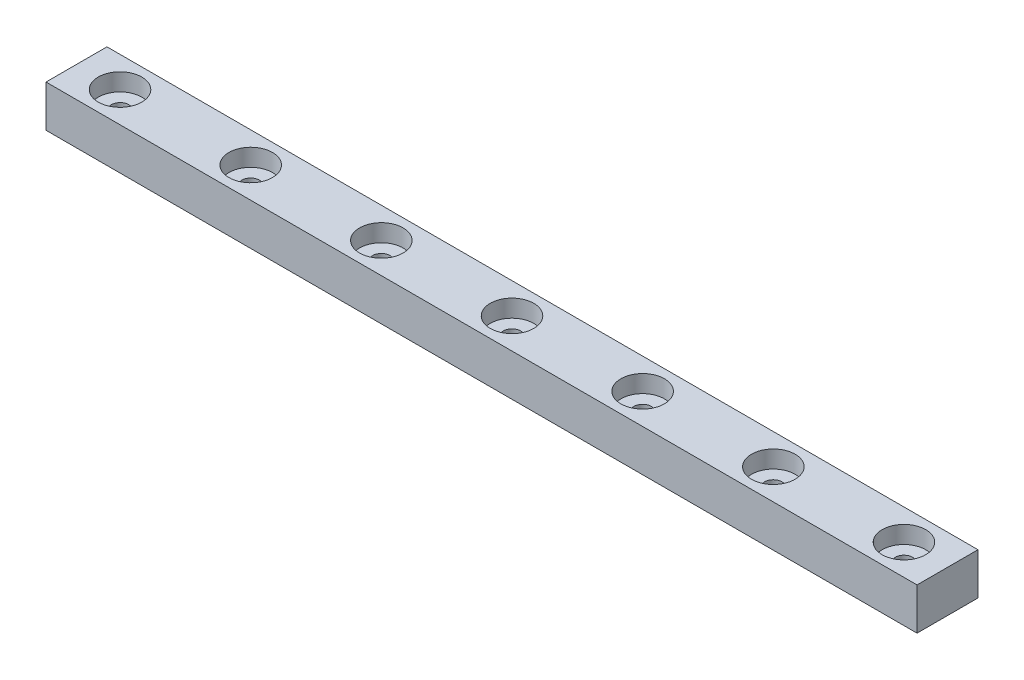
ISO-10303-21;
HEADER;
FILE_DESCRIPTION(('STEP AP214'),'2;1');
FILE_NAME('part.step','',(''),(''),'','','');
FILE_SCHEMA(('AUTOMOTIVE_DESIGN { 1 0 10303 214 1 1 1 1 }'));
ENDSEC;
DATA;
#1=APPLICATION_CONTEXT('core data for automotive mechanical design processes');
#2=APPLICATION_PROTOCOL_DEFINITION('international standard','automotive_design',2000,#1);
#3=PRODUCT_CONTEXT('',#1,'mechanical');
#4=PRODUCT('Part','Part','',(#3));
#5=PRODUCT_RELATED_PRODUCT_CATEGORY('part','',(#4));
#6=PRODUCT_DEFINITION_FORMATION('','',#4);
#7=PRODUCT_DEFINITION_CONTEXT('part definition',#1,'design');
#8=PRODUCT_DEFINITION('design','',#6,#7);
#9=PRODUCT_DEFINITION_SHAPE('','',#8);
#10=(LENGTH_UNIT() NAMED_UNIT(*) SI_UNIT(.MILLI.,.METRE.));
#11=(NAMED_UNIT(*) PLANE_ANGLE_UNIT() SI_UNIT($,.RADIAN.));
#12=(NAMED_UNIT(*) SI_UNIT($,.STERADIAN.) SOLID_ANGLE_UNIT());
#13=UNCERTAINTY_MEASURE_WITH_UNIT(LENGTH_MEASURE(1.E-05),#10,'distance_accuracy_value','');
#14=(GEOMETRIC_REPRESENTATION_CONTEXT(3) GLOBAL_UNCERTAINTY_ASSIGNED_CONTEXT((#13)) GLOBAL_UNIT_ASSIGNED_CONTEXT((#10,
#11,#12)) REPRESENTATION_CONTEXT('',''));
#15=CARTESIAN_POINT('',(0.,0.,0.));
#16=DIRECTION('',(0.,0.,1.));
#17=DIRECTION('',(1.,0.,0.));
#18=AXIS2_PLACEMENT_3D('',#15,#16,#17);
#19=CARTESIAN_POINT('',(50.,0.,-3.5));
#20=DIRECTION('',(0.,0.,-1.));
#21=DIRECTION('',(-1.,0.,0.));
#22=AXIS2_PLACEMENT_3D('',#19,#20,#21);
#23=PLANE('',#22);
#24=DIRECTION('',(-1.,0.,0.));
#25=VECTOR('',#24,1.);
#26=CARTESIAN_POINT('',(50.,4.8,-3.5));
#27=LINE('',#26,#25);
#28=CARTESIAN_POINT('',(50.,4.8,-3.5));
#29=VERTEX_POINT('',#28);
#30=CARTESIAN_POINT('',(-50.,4.8,-3.5));
#31=VERTEX_POINT('',#30);
#32=EDGE_CURVE('E97',#29,#31,#27,.T.);
#33=ORIENTED_EDGE('',*,*,#32,.F.);
#34=DIRECTION('',(0.,1.,0.));
#35=VECTOR('',#34,1.);
#36=CARTESIAN_POINT('',(50.,0.,-3.5));
#37=LINE('',#36,#35);
#38=CARTESIAN_POINT('',(50.,0.,-3.5));
#39=VERTEX_POINT('',#38);
#40=EDGE_CURVE('E11',#39,#29,#37,.T.);
#41=ORIENTED_EDGE('',*,*,#40,.F.);
#42=DIRECTION('',(-1.,0.,0.));
#43=VECTOR('',#42,1.);
#44=CARTESIAN_POINT('',(50.,0.,-3.5));
#45=LINE('',#44,#43);
#46=CARTESIAN_POINT('',(-50.,0.,-3.5));
#47=VERTEX_POINT('',#46);
#48=EDGE_CURVE('E90',#39,#47,#45,.T.);
#49=ORIENTED_EDGE('',*,*,#48,.T.);
#50=DIRECTION('',(0.,1.,0.));
#51=VECTOR('',#50,1.);
#52=CARTESIAN_POINT('',(-50.,0.,-3.5));
#53=LINE('',#52,#51);
#54=EDGE_CURVE('E35',#47,#31,#53,.T.);
#55=ORIENTED_EDGE('',*,*,#54,.T.);
#56=EDGE_LOOP('',(#33,#41,#49,#55));
#57=FACE_BOUND('',#56,.T.);
#58=ADVANCED_FACE('F32',(#57),#23,.T.);
#59=CARTESIAN_POINT('',(50.,0.,3.5));
#60=DIRECTION('',(1.,0.,0.));
#61=DIRECTION('',(0.,0.,-1.));
#62=AXIS2_PLACEMENT_3D('',#59,#60,#61);
#63=PLANE('',#62);
#64=DIRECTION('',(0.,0.,-1.));
#65=VECTOR('',#64,1.);
#66=CARTESIAN_POINT('',(50.,4.8,3.5));
#67=LINE('',#66,#65);
#68=CARTESIAN_POINT('',(50.,4.8,3.5));
#69=VERTEX_POINT('',#68);
#70=EDGE_CURVE('E92',#69,#29,#67,.T.);
#71=ORIENTED_EDGE('',*,*,#70,.F.);
#72=DIRECTION('',(0.,1.,0.));
#73=VECTOR('',#72,1.);
#74=CARTESIAN_POINT('',(50.,0.,3.5));
#75=LINE('',#74,#73);
#76=CARTESIAN_POINT('',(50.,0.,3.5));
#77=VERTEX_POINT('',#76);
#78=EDGE_CURVE('E41',#77,#69,#75,.T.);
#79=ORIENTED_EDGE('',*,*,#78,.F.);
#80=DIRECTION('',(0.,0.,-1.));
#81=VECTOR('',#80,1.);
#82=CARTESIAN_POINT('',(50.,0.,3.5));
#83=LINE('',#82,#81);
#84=EDGE_CURVE('E87',#77,#39,#83,.T.);
#85=ORIENTED_EDGE('',*,*,#84,.T.);
#86=ORIENTED_EDGE('',*,*,#40,.T.);
#87=EDGE_LOOP('',(#71,#79,#85,#86));
#88=FACE_BOUND('',#87,.T.);
#89=ADVANCED_FACE('F108',(#88),#63,.T.);
#90=CARTESIAN_POINT('',(-50.,0.,3.5));
#91=DIRECTION('',(0.,0.,1.));
#92=DIRECTION('',(1.,0.,0.));
#93=AXIS2_PLACEMENT_3D('',#90,#91,#92);
#94=PLANE('',#93);
#95=DIRECTION('',(1.,0.,0.));
#96=VECTOR('',#95,1.);
#97=CARTESIAN_POINT('',(-50.,4.8,3.5));
#98=LINE('',#97,#96);
#99=CARTESIAN_POINT('',(-50.,4.8,3.5));
#100=VERTEX_POINT('',#99);
#101=EDGE_CURVE('E82',#100,#69,#98,.T.);
#102=ORIENTED_EDGE('',*,*,#101,.F.);
#103=DIRECTION('',(0.,1.,0.));
#104=VECTOR('',#103,1.);
#105=CARTESIAN_POINT('',(-50.,0.,3.5));
#106=LINE('',#105,#104);
#107=CARTESIAN_POINT('',(-50.,0.,3.5));
#108=VERTEX_POINT('',#107);
#109=EDGE_CURVE('E77',#108,#100,#106,.T.);
#110=ORIENTED_EDGE('',*,*,#109,.F.);
#111=DIRECTION('',(1.,0.,0.));
#112=VECTOR('',#111,1.);
#113=CARTESIAN_POINT('',(-50.,0.,3.5));
#114=LINE('',#113,#112);
#115=EDGE_CURVE('E80',#108,#77,#114,.T.);
#116=ORIENTED_EDGE('',*,*,#115,.T.);
#117=ORIENTED_EDGE('',*,*,#78,.T.);
#118=EDGE_LOOP('',(#102,#110,#116,#117));
#119=FACE_BOUND('',#118,.T.);
#120=ADVANCED_FACE('F79',(#119),#94,.T.);
#121=CARTESIAN_POINT('',(-50.,0.,-3.5));
#122=DIRECTION('',(-1.,0.,0.));
#123=DIRECTION('',(0.,0.,1.));
#124=AXIS2_PLACEMENT_3D('',#121,#122,#123);
#125=PLANE('',#124);
#126=DIRECTION('',(0.,0.,1.));
#127=VECTOR('',#126,1.);
#128=CARTESIAN_POINT('',(-50.,4.8,-3.5));
#129=LINE('',#128,#127);
#130=EDGE_CURVE('E100',#31,#100,#129,.T.);
#131=ORIENTED_EDGE('',*,*,#130,.F.);
#132=ORIENTED_EDGE('',*,*,#54,.F.);
#133=DIRECTION('',(0.,0.,1.));
#134=VECTOR('',#133,1.);
#135=CARTESIAN_POINT('',(-50.,0.,-3.5));
#136=LINE('',#135,#134);
#137=EDGE_CURVE('E86',#47,#108,#136,.T.);
#138=ORIENTED_EDGE('',*,*,#137,.T.);
#139=ORIENTED_EDGE('',*,*,#109,.T.);
#140=EDGE_LOOP('',(#131,#132,#138,#139));
#141=FACE_BOUND('',#140,.T.);
#142=ADVANCED_FACE('F89',(#141),#125,.T.);
#143=CARTESIAN_POINT('',(0.,0.,0.));
#144=DIRECTION('',(0.,1.,0.));
#145=DIRECTION('',(0.,0.,1.));
#146=AXIS2_PLACEMENT_3D('',#143,#144,#145);
#147=PLANE('',#146);
#148=CARTESIAN_POINT('',(-30.,0.,0.));
#149=DIRECTION('',(0.,1.,0.));
#150=DIRECTION('',(0.,0.,1.));
#151=AXIS2_PLACEMENT_3D('',#148,#149,#150);
#152=CIRCLE('',#151,1.00000000000001);
#153=CARTESIAN_POINT('',(-30.,0.,1.00000000000001));
#154=VERTEX_POINT('',#153);
#155=EDGE_CURVE('E228',#154,#154,#152,.T.);
#156=ORIENTED_EDGE('',*,*,#155,.T.);
#157=EDGE_LOOP('',(#156));
#158=FACE_BOUND('',#157,.T.);
#159=CARTESIAN_POINT('',(-15.,0.,0.));
#160=DIRECTION('',(0.,1.,0.));
#161=DIRECTION('',(0.,0.,1.));
#162=AXIS2_PLACEMENT_3D('',#159,#160,#161);
#163=CIRCLE('',#162,1.00000000000001);
#164=CARTESIAN_POINT('',(-15.,0.,1.00000000000001));
#165=VERTEX_POINT('',#164);
#166=EDGE_CURVE('E239',#165,#165,#163,.T.);
#167=ORIENTED_EDGE('',*,*,#166,.T.);
#168=EDGE_LOOP('',(#167));
#169=FACE_BOUND('',#168,.T.);
#170=CARTESIAN_POINT('',(0.,0.,0.));
#171=DIRECTION('',(0.,1.,0.));
#172=DIRECTION('',(0.,0.,1.));
#173=AXIS2_PLACEMENT_3D('',#170,#171,#172);
#174=CIRCLE('',#173,1.00000000000001);
#175=CARTESIAN_POINT('',(0.,0.,1.00000000000001));
#176=VERTEX_POINT('',#175);
#177=EDGE_CURVE('E251',#176,#176,#174,.T.);
#178=ORIENTED_EDGE('',*,*,#177,.T.);
#179=EDGE_LOOP('',(#178));
#180=FACE_BOUND('',#179,.T.);
#181=CARTESIAN_POINT('',(15.,0.,0.));
#182=DIRECTION('',(0.,1.,0.));
#183=DIRECTION('',(0.,0.,1.));
#184=AXIS2_PLACEMENT_3D('',#181,#182,#183);
#185=CIRCLE('',#184,1.00000000000001);
#186=CARTESIAN_POINT('',(15.,0.,1.00000000000001));
#187=VERTEX_POINT('',#186);
#188=EDGE_CURVE('E263',#187,#187,#185,.T.);
#189=ORIENTED_EDGE('',*,*,#188,.T.);
#190=EDGE_LOOP('',(#189));
#191=FACE_BOUND('',#190,.T.);
#192=CARTESIAN_POINT('',(30.,0.,0.));
#193=DIRECTION('',(0.,1.,0.));
#194=DIRECTION('',(0.,0.,1.));
#195=AXIS2_PLACEMENT_3D('',#192,#193,#194);
#196=CIRCLE('',#195,1.00000000000001);
#197=CARTESIAN_POINT('',(30.,0.,1.00000000000001));
#198=VERTEX_POINT('',#197);
#199=EDGE_CURVE('E275',#198,#198,#196,.T.);
#200=ORIENTED_EDGE('',*,*,#199,.T.);
#201=EDGE_LOOP('',(#200));
#202=FACE_BOUND('',#201,.T.);
#203=CARTESIAN_POINT('',(45.,0.,0.));
#204=DIRECTION('',(0.,1.,0.));
#205=DIRECTION('',(0.,0.,1.));
#206=AXIS2_PLACEMENT_3D('',#203,#204,#205);
#207=CIRCLE('',#206,1.00000000000001);
#208=CARTESIAN_POINT('',(45.,0.,1.00000000000001));
#209=VERTEX_POINT('',#208);
#210=EDGE_CURVE('E287',#209,#209,#207,.T.);
#211=ORIENTED_EDGE('',*,*,#210,.T.);
#212=EDGE_LOOP('',(#211));
#213=FACE_BOUND('',#212,.T.);
#214=CARTESIAN_POINT('',(-45.,0.,0.));
#215=DIRECTION('',(0.,1.,0.));
#216=DIRECTION('',(0.,0.,1.));
#217=AXIS2_PLACEMENT_3D('',#214,#215,#216);
#218=CIRCLE('',#217,1.00000000000001);
#219=CARTESIAN_POINT('',(-45.,0.,1.00000000000001));
#220=VERTEX_POINT('',#219);
#221=EDGE_CURVE('E101',#220,#220,#218,.T.);
#222=ORIENTED_EDGE('',*,*,#221,.T.);
#223=EDGE_LOOP('',(#222));
#224=FACE_BOUND('',#223,.T.);
#225=ORIENTED_EDGE('',*,*,#48,.F.);
#226=ORIENTED_EDGE('',*,*,#84,.F.);
#227=ORIENTED_EDGE('',*,*,#115,.F.);
#228=ORIENTED_EDGE('',*,*,#137,.F.);
#229=EDGE_LOOP('',(#225,#226,#227,#228));
#230=FACE_BOUND('',#229,.T.);
#231=ADVANCED_FACE('F85',(#158,#169,#180,#191,#202,#213,#224,#230),#147,.F.);
#232=CARTESIAN_POINT('',(0.,4.8,0.));
#233=DIRECTION('',(0.,1.,0.));
#234=DIRECTION('',(0.,0.,1.));
#235=AXIS2_PLACEMENT_3D('',#232,#233,#234);
#236=PLANE('',#235);
#237=CARTESIAN_POINT('',(-30.,4.8,0.));
#238=DIRECTION('',(0.,1.,0.));
#239=DIRECTION('',(0.,0.,1.));
#240=AXIS2_PLACEMENT_3D('',#237,#238,#239);
#241=CIRCLE('',#240,2.5);
#242=CARTESIAN_POINT('',(-30.,4.8,2.5));
#243=VERTEX_POINT('',#242);
#244=EDGE_CURVE('E221',#243,#243,#241,.T.);
#245=ORIENTED_EDGE('',*,*,#244,.F.);
#246=EDGE_LOOP('',(#245));
#247=FACE_BOUND('',#246,.T.);
#248=CARTESIAN_POINT('',(-15.,4.8,0.));
#249=DIRECTION('',(0.,1.,0.));
#250=DIRECTION('',(0.,0.,1.));
#251=AXIS2_PLACEMENT_3D('',#248,#249,#250);
#252=CIRCLE('',#251,2.5);
#253=CARTESIAN_POINT('',(-15.,4.8,2.5));
#254=VERTEX_POINT('',#253);
#255=EDGE_CURVE('E230',#254,#254,#252,.T.);
#256=ORIENTED_EDGE('',*,*,#255,.F.);
#257=EDGE_LOOP('',(#256));
#258=FACE_BOUND('',#257,.T.);
#259=CARTESIAN_POINT('',(0.,4.8,0.));
#260=DIRECTION('',(0.,1.,0.));
#261=DIRECTION('',(0.,0.,1.));
#262=AXIS2_PLACEMENT_3D('',#259,#260,#261);
#263=CIRCLE('',#262,2.5);
#264=CARTESIAN_POINT('',(0.,4.8,2.5));
#265=VERTEX_POINT('',#264);
#266=EDGE_CURVE('E242',#265,#265,#263,.T.);
#267=ORIENTED_EDGE('',*,*,#266,.F.);
#268=EDGE_LOOP('',(#267));
#269=FACE_BOUND('',#268,.T.);
#270=CARTESIAN_POINT('',(15.,4.8,0.));
#271=DIRECTION('',(0.,1.,0.));
#272=DIRECTION('',(0.,0.,1.));
#273=AXIS2_PLACEMENT_3D('',#270,#271,#272);
#274=CIRCLE('',#273,2.5);
#275=CARTESIAN_POINT('',(15.,4.8,2.5));
#276=VERTEX_POINT('',#275);
#277=EDGE_CURVE('E254',#276,#276,#274,.T.);
#278=ORIENTED_EDGE('',*,*,#277,.F.);
#279=EDGE_LOOP('',(#278));
#280=FACE_BOUND('',#279,.T.);
#281=CARTESIAN_POINT('',(30.,4.8,0.));
#282=DIRECTION('',(0.,1.,0.));
#283=DIRECTION('',(0.,0.,1.));
#284=AXIS2_PLACEMENT_3D('',#281,#282,#283);
#285=CIRCLE('',#284,2.5);
#286=CARTESIAN_POINT('',(30.,4.8,2.5));
#287=VERTEX_POINT('',#286);
#288=EDGE_CURVE('E266',#287,#287,#285,.T.);
#289=ORIENTED_EDGE('',*,*,#288,.F.);
#290=EDGE_LOOP('',(#289));
#291=FACE_BOUND('',#290,.T.);
#292=CARTESIAN_POINT('',(45.,4.8,0.));
#293=DIRECTION('',(0.,1.,0.));
#294=DIRECTION('',(0.,0.,1.));
#295=AXIS2_PLACEMENT_3D('',#292,#293,#294);
#296=CIRCLE('',#295,2.5);
#297=CARTESIAN_POINT('',(45.,4.8,2.5));
#298=VERTEX_POINT('',#297);
#299=EDGE_CURVE('E278',#298,#298,#296,.T.);
#300=ORIENTED_EDGE('',*,*,#299,.F.);
#301=EDGE_LOOP('',(#300));
#302=FACE_BOUND('',#301,.T.);
#303=CARTESIAN_POINT('',(-45.,4.8,0.));
#304=DIRECTION('',(0.,1.,0.));
#305=DIRECTION('',(0.,0.,1.));
#306=AXIS2_PLACEMENT_3D('',#303,#304,#305);
#307=CIRCLE('',#306,2.5);
#308=CARTESIAN_POINT('',(-45.,4.8,2.5));
#309=VERTEX_POINT('',#308);
#310=EDGE_CURVE('E290',#309,#309,#307,.T.);
#311=ORIENTED_EDGE('',*,*,#310,.F.);
#312=EDGE_LOOP('',(#311));
#313=FACE_BOUND('',#312,.T.);
#314=ORIENTED_EDGE('',*,*,#32,.T.);
#315=ORIENTED_EDGE('',*,*,#130,.T.);
#316=ORIENTED_EDGE('',*,*,#101,.T.);
#317=ORIENTED_EDGE('',*,*,#70,.T.);
#318=EDGE_LOOP('',(#314,#315,#316,#317));
#319=FACE_BOUND('',#318,.T.);
#320=ADVANCED_FACE('F107',(#247,#258,#269,#280,#291,#302,#313,#319),#236,.T.);
#321=CARTESIAN_POINT('',(-45.,4.8,0.));
#322=DIRECTION('',(0.,1.,0.));
#323=DIRECTION('',(0.,0.,1.));
#324=AXIS2_PLACEMENT_3D('',#321,#322,#323);
#325=CYLINDRICAL_SURFACE('',#324,1.00000000000001);
#326=ORIENTED_EDGE('',*,*,#221,.F.);
#327=EDGE_LOOP('',(#326));
#328=FACE_BOUND('',#327,.T.);
#329=CARTESIAN_POINT('',(-45.,2.8,0.));
#330=DIRECTION('',(0.,1.,0.));
#331=DIRECTION('',(0.,0.,1.));
#332=AXIS2_PLACEMENT_3D('',#329,#330,#331);
#333=CIRCLE('',#332,1.00000000000001);
#334=CARTESIAN_POINT('',(-45.,2.8,1.00000000000001));
#335=VERTEX_POINT('',#334);
#336=EDGE_CURVE('E296',#335,#335,#333,.T.);
#337=ORIENTED_EDGE('',*,*,#336,.T.);
#338=EDGE_LOOP('',(#337));
#339=FACE_BOUND('',#338,.T.);
#340=ADVANCED_FACE('F126',(#328,#339),#325,.F.);
#341=CARTESIAN_POINT('',(-44.,2.8,0.));
#342=DIRECTION('',(0.,-1.,0.));
#343=DIRECTION('',(0.,0.,-1.));
#344=AXIS2_PLACEMENT_3D('',#341,#342,#343);
#345=PLANE('',#344);
#346=ORIENTED_EDGE('',*,*,#336,.F.);
#347=EDGE_LOOP('',(#346));
#348=FACE_BOUND('',#347,.T.);
#349=CARTESIAN_POINT('',(-45.,2.8,0.));
#350=DIRECTION('',(0.,1.,0.));
#351=DIRECTION('',(0.,0.,1.));
#352=AXIS2_PLACEMENT_3D('',#349,#350,#351);
#353=CIRCLE('',#352,2.5);
#354=CARTESIAN_POINT('',(-45.,2.8,2.5));
#355=VERTEX_POINT('',#354);
#356=EDGE_CURVE('E293',#355,#355,#353,.T.);
#357=ORIENTED_EDGE('',*,*,#356,.T.);
#358=EDGE_LOOP('',(#357));
#359=FACE_BOUND('',#358,.T.);
#360=ADVANCED_FACE('F133',(#348,#359),#345,.F.);
#361=CARTESIAN_POINT('',(-45.,4.8,0.));
#362=DIRECTION('',(0.,1.,0.));
#363=DIRECTION('',(0.,0.,1.));
#364=AXIS2_PLACEMENT_3D('',#361,#362,#363);
#365=CYLINDRICAL_SURFACE('',#364,2.5);
#366=ORIENTED_EDGE('',*,*,#356,.F.);
#367=EDGE_LOOP('',(#366));
#368=FACE_BOUND('',#367,.T.);
#369=ORIENTED_EDGE('',*,*,#310,.T.);
#370=EDGE_LOOP('',(#369));
#371=FACE_BOUND('',#370,.T.);
#372=ADVANCED_FACE('F137',(#368,#371),#365,.F.);
#373=CARTESIAN_POINT('',(45.,4.8,0.));
#374=DIRECTION('',(0.,1.,0.));
#375=DIRECTION('',(0.,0.,1.));
#376=AXIS2_PLACEMENT_3D('',#373,#374,#375);
#377=CYLINDRICAL_SURFACE('',#376,1.00000000000001);
#378=ORIENTED_EDGE('',*,*,#210,.F.);
#379=EDGE_LOOP('',(#378));
#380=FACE_BOUND('',#379,.T.);
#381=CARTESIAN_POINT('',(45.,2.8,0.));
#382=DIRECTION('',(0.,1.,0.));
#383=DIRECTION('',(0.,0.,1.));
#384=AXIS2_PLACEMENT_3D('',#381,#382,#383);
#385=CIRCLE('',#384,1.00000000000001);
#386=CARTESIAN_POINT('',(45.,2.8,1.00000000000001));
#387=VERTEX_POINT('',#386);
#388=EDGE_CURVE('E284',#387,#387,#385,.T.);
#389=ORIENTED_EDGE('',*,*,#388,.T.);
#390=EDGE_LOOP('',(#389));
#391=FACE_BOUND('',#390,.T.);
#392=ADVANCED_FACE('F141',(#380,#391),#377,.F.);
#393=CARTESIAN_POINT('',(46.,2.8,0.));
#394=DIRECTION('',(0.,-1.,0.));
#395=DIRECTION('',(0.,0.,-1.));
#396=AXIS2_PLACEMENT_3D('',#393,#394,#395);
#397=PLANE('',#396);
#398=ORIENTED_EDGE('',*,*,#388,.F.);
#399=EDGE_LOOP('',(#398));
#400=FACE_BOUND('',#399,.T.);
#401=CARTESIAN_POINT('',(45.,2.8,0.));
#402=DIRECTION('',(0.,1.,0.));
#403=DIRECTION('',(0.,0.,1.));
#404=AXIS2_PLACEMENT_3D('',#401,#402,#403);
#405=CIRCLE('',#404,2.5);
#406=CARTESIAN_POINT('',(45.,2.8,2.5));
#407=VERTEX_POINT('',#406);
#408=EDGE_CURVE('E281',#407,#407,#405,.T.);
#409=ORIENTED_EDGE('',*,*,#408,.T.);
#410=EDGE_LOOP('',(#409));
#411=FACE_BOUND('',#410,.T.);
#412=ADVANCED_FACE('F145',(#400,#411),#397,.F.);
#413=CARTESIAN_POINT('',(45.,4.8,0.));
#414=DIRECTION('',(0.,1.,0.));
#415=DIRECTION('',(0.,0.,1.));
#416=AXIS2_PLACEMENT_3D('',#413,#414,#415);
#417=CYLINDRICAL_SURFACE('',#416,2.5);
#418=ORIENTED_EDGE('',*,*,#408,.F.);
#419=EDGE_LOOP('',(#418));
#420=FACE_BOUND('',#419,.T.);
#421=ORIENTED_EDGE('',*,*,#299,.T.);
#422=EDGE_LOOP('',(#421));
#423=FACE_BOUND('',#422,.T.);
#424=ADVANCED_FACE('F149',(#420,#423),#417,.F.);
#425=CARTESIAN_POINT('',(30.,4.8,0.));
#426=DIRECTION('',(0.,1.,0.));
#427=DIRECTION('',(0.,0.,1.));
#428=AXIS2_PLACEMENT_3D('',#425,#426,#427);
#429=CYLINDRICAL_SURFACE('',#428,1.00000000000001);
#430=ORIENTED_EDGE('',*,*,#199,.F.);
#431=EDGE_LOOP('',(#430));
#432=FACE_BOUND('',#431,.T.);
#433=CARTESIAN_POINT('',(30.,2.8,0.));
#434=DIRECTION('',(0.,1.,0.));
#435=DIRECTION('',(0.,0.,1.));
#436=AXIS2_PLACEMENT_3D('',#433,#434,#435);
#437=CIRCLE('',#436,1.00000000000001);
#438=CARTESIAN_POINT('',(30.,2.8,1.00000000000001));
#439=VERTEX_POINT('',#438);
#440=EDGE_CURVE('E272',#439,#439,#437,.T.);
#441=ORIENTED_EDGE('',*,*,#440,.T.);
#442=EDGE_LOOP('',(#441));
#443=FACE_BOUND('',#442,.T.);
#444=ADVANCED_FACE('F153',(#432,#443),#429,.F.);
#445=CARTESIAN_POINT('',(31.,2.8,0.));
#446=DIRECTION('',(0.,-1.,0.));
#447=DIRECTION('',(0.,0.,-1.));
#448=AXIS2_PLACEMENT_3D('',#445,#446,#447);
#449=PLANE('',#448);
#450=ORIENTED_EDGE('',*,*,#440,.F.);
#451=EDGE_LOOP('',(#450));
#452=FACE_BOUND('',#451,.T.);
#453=CARTESIAN_POINT('',(30.,2.8,0.));
#454=DIRECTION('',(0.,1.,0.));
#455=DIRECTION('',(0.,0.,1.));
#456=AXIS2_PLACEMENT_3D('',#453,#454,#455);
#457=CIRCLE('',#456,2.5);
#458=CARTESIAN_POINT('',(30.,2.8,2.5));
#459=VERTEX_POINT('',#458);
#460=EDGE_CURVE('E269',#459,#459,#457,.T.);
#461=ORIENTED_EDGE('',*,*,#460,.T.);
#462=EDGE_LOOP('',(#461));
#463=FACE_BOUND('',#462,.T.);
#464=ADVANCED_FACE('F157',(#452,#463),#449,.F.);
#465=CARTESIAN_POINT('',(30.,4.8,0.));
#466=DIRECTION('',(0.,1.,0.));
#467=DIRECTION('',(0.,0.,1.));
#468=AXIS2_PLACEMENT_3D('',#465,#466,#467);
#469=CYLINDRICAL_SURFACE('',#468,2.5);
#470=ORIENTED_EDGE('',*,*,#460,.F.);
#471=EDGE_LOOP('',(#470));
#472=FACE_BOUND('',#471,.T.);
#473=ORIENTED_EDGE('',*,*,#288,.T.);
#474=EDGE_LOOP('',(#473));
#475=FACE_BOUND('',#474,.T.);
#476=ADVANCED_FACE('F161',(#472,#475),#469,.F.);
#477=CARTESIAN_POINT('',(15.,4.8,0.));
#478=DIRECTION('',(0.,1.,0.));
#479=DIRECTION('',(0.,0.,1.));
#480=AXIS2_PLACEMENT_3D('',#477,#478,#479);
#481=CYLINDRICAL_SURFACE('',#480,1.00000000000001);
#482=ORIENTED_EDGE('',*,*,#188,.F.);
#483=EDGE_LOOP('',(#482));
#484=FACE_BOUND('',#483,.T.);
#485=CARTESIAN_POINT('',(15.,2.8,0.));
#486=DIRECTION('',(0.,1.,0.));
#487=DIRECTION('',(0.,0.,1.));
#488=AXIS2_PLACEMENT_3D('',#485,#486,#487);
#489=CIRCLE('',#488,1.00000000000001);
#490=CARTESIAN_POINT('',(15.,2.8,1.00000000000001));
#491=VERTEX_POINT('',#490);
#492=EDGE_CURVE('E260',#491,#491,#489,.T.);
#493=ORIENTED_EDGE('',*,*,#492,.T.);
#494=EDGE_LOOP('',(#493));
#495=FACE_BOUND('',#494,.T.);
#496=ADVANCED_FACE('F165',(#484,#495),#481,.F.);
#497=CARTESIAN_POINT('',(16.,2.8,0.));
#498=DIRECTION('',(0.,-1.,0.));
#499=DIRECTION('',(0.,0.,-1.));
#500=AXIS2_PLACEMENT_3D('',#497,#498,#499);
#501=PLANE('',#500);
#502=ORIENTED_EDGE('',*,*,#492,.F.);
#503=EDGE_LOOP('',(#502));
#504=FACE_BOUND('',#503,.T.);
#505=CARTESIAN_POINT('',(15.,2.8,0.));
#506=DIRECTION('',(0.,1.,0.));
#507=DIRECTION('',(0.,0.,1.));
#508=AXIS2_PLACEMENT_3D('',#505,#506,#507);
#509=CIRCLE('',#508,2.5);
#510=CARTESIAN_POINT('',(15.,2.8,2.5));
#511=VERTEX_POINT('',#510);
#512=EDGE_CURVE('E257',#511,#511,#509,.T.);
#513=ORIENTED_EDGE('',*,*,#512,.T.);
#514=EDGE_LOOP('',(#513));
#515=FACE_BOUND('',#514,.T.);
#516=ADVANCED_FACE('F169',(#504,#515),#501,.F.);
#517=CARTESIAN_POINT('',(15.,4.8,0.));
#518=DIRECTION('',(0.,1.,0.));
#519=DIRECTION('',(0.,0.,1.));
#520=AXIS2_PLACEMENT_3D('',#517,#518,#519);
#521=CYLINDRICAL_SURFACE('',#520,2.5);
#522=ORIENTED_EDGE('',*,*,#512,.F.);
#523=EDGE_LOOP('',(#522));
#524=FACE_BOUND('',#523,.T.);
#525=ORIENTED_EDGE('',*,*,#277,.T.);
#526=EDGE_LOOP('',(#525));
#527=FACE_BOUND('',#526,.T.);
#528=ADVANCED_FACE('F173',(#524,#527),#521,.F.);
#529=CARTESIAN_POINT('',(0.,4.8,0.));
#530=DIRECTION('',(0.,1.,0.));
#531=DIRECTION('',(0.,0.,1.));
#532=AXIS2_PLACEMENT_3D('',#529,#530,#531);
#533=CYLINDRICAL_SURFACE('',#532,1.00000000000001);
#534=ORIENTED_EDGE('',*,*,#177,.F.);
#535=EDGE_LOOP('',(#534));
#536=FACE_BOUND('',#535,.T.);
#537=CARTESIAN_POINT('',(0.,2.8,0.));
#538=DIRECTION('',(0.,1.,0.));
#539=DIRECTION('',(0.,0.,1.));
#540=AXIS2_PLACEMENT_3D('',#537,#538,#539);
#541=CIRCLE('',#540,1.00000000000001);
#542=CARTESIAN_POINT('',(0.,2.8,1.00000000000001));
#543=VERTEX_POINT('',#542);
#544=EDGE_CURVE('E248',#543,#543,#541,.T.);
#545=ORIENTED_EDGE('',*,*,#544,.T.);
#546=EDGE_LOOP('',(#545));
#547=FACE_BOUND('',#546,.T.);
#548=ADVANCED_FACE('F177',(#536,#547),#533,.F.);
#549=CARTESIAN_POINT('',(1.00000000000001,2.8,0.));
#550=DIRECTION('',(0.,-1.,0.));
#551=DIRECTION('',(0.,0.,-1.));
#552=AXIS2_PLACEMENT_3D('',#549,#550,#551);
#553=PLANE('',#552);
#554=ORIENTED_EDGE('',*,*,#544,.F.);
#555=EDGE_LOOP('',(#554));
#556=FACE_BOUND('',#555,.T.);
#557=CARTESIAN_POINT('',(0.,2.8,0.));
#558=DIRECTION('',(0.,1.,0.));
#559=DIRECTION('',(0.,0.,1.));
#560=AXIS2_PLACEMENT_3D('',#557,#558,#559);
#561=CIRCLE('',#560,2.5);
#562=CARTESIAN_POINT('',(0.,2.8,2.5));
#563=VERTEX_POINT('',#562);
#564=EDGE_CURVE('E245',#563,#563,#561,.T.);
#565=ORIENTED_EDGE('',*,*,#564,.T.);
#566=EDGE_LOOP('',(#565));
#567=FACE_BOUND('',#566,.T.);
#568=ADVANCED_FACE('F181',(#556,#567),#553,.F.);
#569=CARTESIAN_POINT('',(0.,4.8,0.));
#570=DIRECTION('',(0.,1.,0.));
#571=DIRECTION('',(0.,0.,1.));
#572=AXIS2_PLACEMENT_3D('',#569,#570,#571);
#573=CYLINDRICAL_SURFACE('',#572,2.5);
#574=ORIENTED_EDGE('',*,*,#564,.F.);
#575=EDGE_LOOP('',(#574));
#576=FACE_BOUND('',#575,.T.);
#577=ORIENTED_EDGE('',*,*,#266,.T.);
#578=EDGE_LOOP('',(#577));
#579=FACE_BOUND('',#578,.T.);
#580=ADVANCED_FACE('F185',(#576,#579),#573,.F.);
#581=CARTESIAN_POINT('',(-15.,4.8,0.));
#582=DIRECTION('',(0.,1.,0.));
#583=DIRECTION('',(0.,0.,1.));
#584=AXIS2_PLACEMENT_3D('',#581,#582,#583);
#585=CYLINDRICAL_SURFACE('',#584,1.00000000000001);
#586=ORIENTED_EDGE('',*,*,#166,.F.);
#587=EDGE_LOOP('',(#586));
#588=FACE_BOUND('',#587,.T.);
#589=CARTESIAN_POINT('',(-15.,2.8,0.));
#590=DIRECTION('',(0.,1.,0.));
#591=DIRECTION('',(0.,0.,1.));
#592=AXIS2_PLACEMENT_3D('',#589,#590,#591);
#593=CIRCLE('',#592,1.00000000000001);
#594=CARTESIAN_POINT('',(-15.,2.8,1.00000000000001));
#595=VERTEX_POINT('',#594);
#596=EDGE_CURVE('E236',#595,#595,#593,.T.);
#597=ORIENTED_EDGE('',*,*,#596,.T.);
#598=EDGE_LOOP('',(#597));
#599=FACE_BOUND('',#598,.T.);
#600=ADVANCED_FACE('F189',(#588,#599),#585,.F.);
#601=CARTESIAN_POINT('',(-14.,2.8,0.));
#602=DIRECTION('',(0.,-1.,0.));
#603=DIRECTION('',(0.,0.,-1.));
#604=AXIS2_PLACEMENT_3D('',#601,#602,#603);
#605=PLANE('',#604);
#606=ORIENTED_EDGE('',*,*,#596,.F.);
#607=EDGE_LOOP('',(#606));
#608=FACE_BOUND('',#607,.T.);
#609=CARTESIAN_POINT('',(-15.,2.8,0.));
#610=DIRECTION('',(0.,1.,0.));
#611=DIRECTION('',(0.,0.,1.));
#612=AXIS2_PLACEMENT_3D('',#609,#610,#611);
#613=CIRCLE('',#612,2.5);
#614=CARTESIAN_POINT('',(-15.,2.8,2.5));
#615=VERTEX_POINT('',#614);
#616=EDGE_CURVE('E233',#615,#615,#613,.T.);
#617=ORIENTED_EDGE('',*,*,#616,.T.);
#618=EDGE_LOOP('',(#617));
#619=FACE_BOUND('',#618,.T.);
#620=ADVANCED_FACE('F193',(#608,#619),#605,.F.);
#621=CARTESIAN_POINT('',(-15.,4.8,0.));
#622=DIRECTION('',(0.,1.,0.));
#623=DIRECTION('',(0.,0.,1.));
#624=AXIS2_PLACEMENT_3D('',#621,#622,#623);
#625=CYLINDRICAL_SURFACE('',#624,2.5);
#626=ORIENTED_EDGE('',*,*,#616,.F.);
#627=EDGE_LOOP('',(#626));
#628=FACE_BOUND('',#627,.T.);
#629=ORIENTED_EDGE('',*,*,#255,.T.);
#630=EDGE_LOOP('',(#629));
#631=FACE_BOUND('',#630,.T.);
#632=ADVANCED_FACE('F197',(#628,#631),#625,.F.);
#633=CARTESIAN_POINT('',(-30.,4.8,0.));
#634=DIRECTION('',(0.,1.,0.));
#635=DIRECTION('',(0.,0.,1.));
#636=AXIS2_PLACEMENT_3D('',#633,#634,#635);
#637=CYLINDRICAL_SURFACE('',#636,1.00000000000001);
#638=ORIENTED_EDGE('',*,*,#155,.F.);
#639=EDGE_LOOP('',(#638));
#640=FACE_BOUND('',#639,.T.);
#641=CARTESIAN_POINT('',(-30.,2.8,0.));
#642=DIRECTION('',(0.,1.,0.));
#643=DIRECTION('',(0.,0.,1.));
#644=AXIS2_PLACEMENT_3D('',#641,#642,#643);
#645=CIRCLE('',#644,1.00000000000001);
#646=CARTESIAN_POINT('',(-30.,2.8,1.00000000000001));
#647=VERTEX_POINT('',#646);
#648=EDGE_CURVE('E223',#647,#647,#645,.T.);
#649=ORIENTED_EDGE('',*,*,#648,.T.);
#650=EDGE_LOOP('',(#649));
#651=FACE_BOUND('',#650,.T.);
#652=ADVANCED_FACE('F201',(#640,#651),#637,.F.);
#653=CARTESIAN_POINT('',(-29.,2.8,0.));
#654=DIRECTION('',(0.,-1.,0.));
#655=DIRECTION('',(0.,0.,-1.));
#656=AXIS2_PLACEMENT_3D('',#653,#654,#655);
#657=PLANE('',#656);
#658=ORIENTED_EDGE('',*,*,#648,.F.);
#659=EDGE_LOOP('',(#658));
#660=FACE_BOUND('',#659,.T.);
#661=CARTESIAN_POINT('',(-30.,2.8,0.));
#662=DIRECTION('',(0.,1.,0.));
#663=DIRECTION('',(0.,0.,1.));
#664=AXIS2_PLACEMENT_3D('',#661,#662,#663);
#665=CIRCLE('',#664,2.5);
#666=CARTESIAN_POINT('',(-30.,2.8,2.5));
#667=VERTEX_POINT('',#666);
#668=EDGE_CURVE('E218',#667,#667,#665,.T.);
#669=ORIENTED_EDGE('',*,*,#668,.T.);
#670=EDGE_LOOP('',(#669));
#671=FACE_BOUND('',#670,.T.);
#672=ADVANCED_FACE('F205',(#660,#671),#657,.F.);
#673=CARTESIAN_POINT('',(-30.,4.8,0.));
#674=DIRECTION('',(0.,1.,0.));
#675=DIRECTION('',(0.,0.,1.));
#676=AXIS2_PLACEMENT_3D('',#673,#674,#675);
#677=CYLINDRICAL_SURFACE('',#676,2.5);
#678=ORIENTED_EDGE('',*,*,#668,.F.);
#679=EDGE_LOOP('',(#678));
#680=FACE_BOUND('',#679,.T.);
#681=ORIENTED_EDGE('',*,*,#244,.T.);
#682=EDGE_LOOP('',(#681));
#683=FACE_BOUND('',#682,.T.);
#684=ADVANCED_FACE('F209',(#680,#683),#677,.F.);
#685=CLOSED_SHELL('',(#58,#89,#120,#142,#231,#320,#340,#360,#372,#392,#412,#424,#444,#464,#476,
#496,#516,#528,#548,#568,#580,#600,#620,#632,#652,#672,#684));
#686=MANIFOLD_SOLID_BREP('B2',#685);
#687=ADVANCED_BREP_SHAPE_REPRESENTATION('',(#18,#686),#14);
#688=SHAPE_DEFINITION_REPRESENTATION(#9,#687);
ENDSEC;
END-ISO-10303-21;
